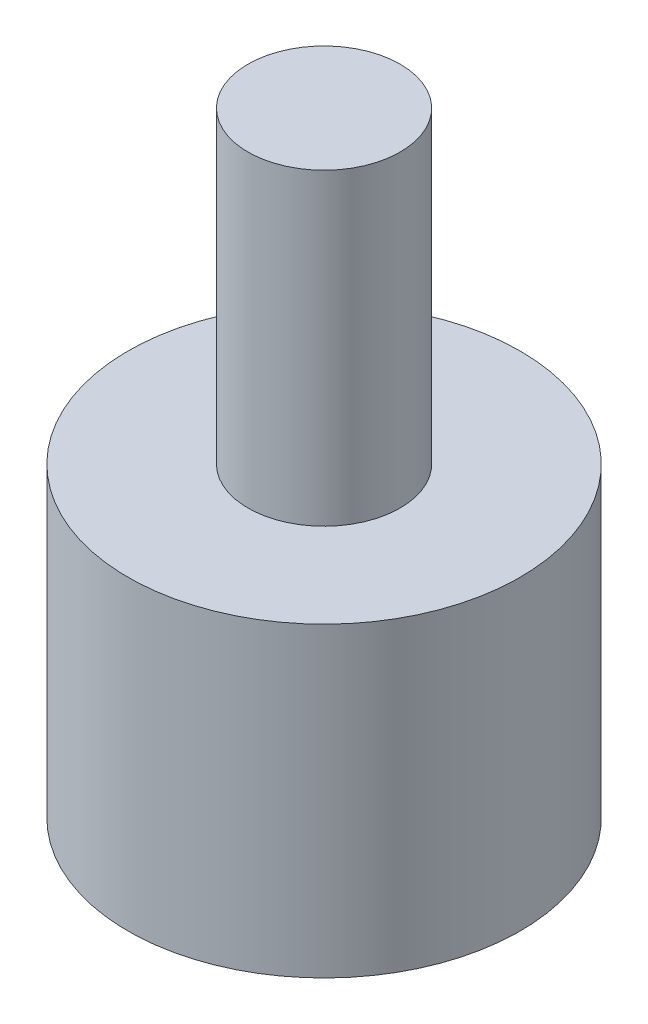
ISO-10303-21;
HEADER;
FILE_DESCRIPTION(('STEP AP214'),'2;1');
FILE_NAME('part.step','',(''),(''),'','','');
FILE_SCHEMA(('AUTOMOTIVE_DESIGN { 1 0 10303 214 1 1 1 1 }'));
ENDSEC;
DATA;
#1=APPLICATION_CONTEXT('core data for automotive mechanical design processes');
#2=APPLICATION_PROTOCOL_DEFINITION('international standard','automotive_design',2000,#1);
#3=PRODUCT_CONTEXT('',#1,'mechanical');
#4=PRODUCT('Part','Part','',(#3));
#5=PRODUCT_RELATED_PRODUCT_CATEGORY('part','',(#4));
#6=PRODUCT_DEFINITION_FORMATION('','',#4);
#7=PRODUCT_DEFINITION_CONTEXT('part definition',#1,'design');
#8=PRODUCT_DEFINITION('design','',#6,#7);
#9=PRODUCT_DEFINITION_SHAPE('','',#8);
#10=(LENGTH_UNIT() NAMED_UNIT(*) SI_UNIT(.MILLI.,.METRE.));
#11=(NAMED_UNIT(*) PLANE_ANGLE_UNIT() SI_UNIT($,.RADIAN.));
#12=(NAMED_UNIT(*) SI_UNIT($,.STERADIAN.) SOLID_ANGLE_UNIT());
#13=UNCERTAINTY_MEASURE_WITH_UNIT(LENGTH_MEASURE(1.E-05),#10,'distance_accuracy_value','');
#14=(GEOMETRIC_REPRESENTATION_CONTEXT(3) GLOBAL_UNCERTAINTY_ASSIGNED_CONTEXT((#13)) GLOBAL_UNIT_ASSIGNED_CONTEXT((#10,
#11,#12)) REPRESENTATION_CONTEXT('',''));
#15=CARTESIAN_POINT('',(0.,0.,0.));
#16=DIRECTION('',(0.,0.,1.));
#17=DIRECTION('',(1.,0.,0.));
#18=AXIS2_PLACEMENT_3D('',#15,#16,#17);
#19=CARTESIAN_POINT('',(0.,6.35,0.));
#20=DIRECTION('',(0.,-1.,0.));
#21=DIRECTION('',(-1.,0.,0.));
#22=AXIS2_PLACEMENT_3D('',#19,#20,#21);
#23=SPHERICAL_SURFACE('',#22,6.35);
#24=CARTESIAN_POINT('',(0.,3.5,0.));
#25=DIRECTION('',(0.,-1.,0.));
#26=DIRECTION('',(0.,0.,-1.));
#27=AXIS2_PLACEMENT_3D('',#24,#25,#26);
#28=CIRCLE('',#27,5.67450438364444);
#29=CARTESIAN_POINT('',(0.,3.5,-5.67450438364444));
#30=VERTEX_POINT('',#29);
#31=EDGE_CURVE('E10',#30,#30,#28,.T.);
#32=ORIENTED_EDGE('',*,*,#31,.T.);
#33=EDGE_LOOP('',(#32));
#34=FACE_BOUND('',#33,.T.);
#35=ADVANCED_FACE('F30',(#34),#23,.T.);
#36=CARTESIAN_POINT('',(5.67450438364444,3.5,0.));
#37=DIRECTION('',(0.,-1.,0.));
#38=DIRECTION('',(0.,0.,-1.));
#39=AXIS2_PLACEMENT_3D('',#36,#37,#38);
#40=PLANE('',#39);
#41=CARTESIAN_POINT('',(0.,3.5,0.));
#42=DIRECTION('',(0.,-1.,0.));
#43=DIRECTION('',(0.,0.,-1.));
#44=AXIS2_PLACEMENT_3D('',#41,#42,#43);
#45=CIRCLE('',#44,10.3);
#46=CARTESIAN_POINT('',(0.,3.5,-10.3));
#47=VERTEX_POINT('',#46);
#48=EDGE_CURVE('E36',#47,#47,#45,.T.);
#49=ORIENTED_EDGE('',*,*,#48,.T.);
#50=EDGE_LOOP('',(#49));
#51=FACE_BOUND('',#50,.T.);
#52=ORIENTED_EDGE('',*,*,#31,.F.);
#53=EDGE_LOOP('',(#52));
#54=FACE_BOUND('',#53,.T.);
#55=ADVANCED_FACE('F65',(#51,#54),#40,.T.);
#56=CARTESIAN_POINT('',(0.,-22.939375,0.));
#57=DIRECTION('',(0.,-1.,0.));
#58=DIRECTION('',(0.,0.,-1.));
#59=AXIS2_PLACEMENT_3D('',#56,#57,#58);
#60=CYLINDRICAL_SURFACE('',#59,10.3);
#61=CARTESIAN_POINT('',(0.,19.6,0.));
#62=DIRECTION('',(0.,-1.,0.));
#63=DIRECTION('',(0.,0.,-1.));
#64=AXIS2_PLACEMENT_3D('',#61,#62,#63);
#65=CIRCLE('',#64,10.3);
#66=CARTESIAN_POINT('',(0.,19.6,-10.3));
#67=VERTEX_POINT('',#66);
#68=EDGE_CURVE('E40',#67,#67,#65,.T.);
#69=ORIENTED_EDGE('',*,*,#68,.T.);
#70=EDGE_LOOP('',(#69));
#71=FACE_BOUND('',#70,.T.);
#72=ORIENTED_EDGE('',*,*,#48,.F.);
#73=EDGE_LOOP('',(#72));
#74=FACE_BOUND('',#73,.T.);
#75=ADVANCED_FACE('F69',(#71,#74),#60,.T.);
#76=CARTESIAN_POINT('',(10.3,19.6,0.));
#77=DIRECTION('',(0.,1.,0.));
#78=DIRECTION('',(0.,0.,1.));
#79=AXIS2_PLACEMENT_3D('',#76,#77,#78);
#80=PLANE('',#79);
#81=CARTESIAN_POINT('',(0.,19.6,0.));
#82=DIRECTION('',(0.,-1.,0.));
#83=DIRECTION('',(0.,0.,-1.));
#84=AXIS2_PLACEMENT_3D('',#81,#82,#83);
#85=CIRCLE('',#84,4.);
#86=CARTESIAN_POINT('',(0.,19.6,-4.));
#87=VERTEX_POINT('',#86);
#88=EDGE_CURVE('E44',#87,#87,#85,.T.);
#89=ORIENTED_EDGE('',*,*,#88,.T.);
#90=EDGE_LOOP('',(#89));
#91=FACE_BOUND('',#90,.T.);
#92=ORIENTED_EDGE('',*,*,#68,.F.);
#93=EDGE_LOOP('',(#92));
#94=FACE_BOUND('',#93,.T.);
#95=ADVANCED_FACE('F62',(#91,#94),#80,.T.);
#96=CARTESIAN_POINT('',(0.,-22.939375,0.));
#97=DIRECTION('',(0.,-1.,0.));
#98=DIRECTION('',(0.,0.,-1.));
#99=AXIS2_PLACEMENT_3D('',#96,#97,#98);
#100=CYLINDRICAL_SURFACE('',#99,4.);
#101=CARTESIAN_POINT('',(0.,35.8,0.));
#102=DIRECTION('',(0.,-1.,0.));
#103=DIRECTION('',(0.,0.,-1.));
#104=AXIS2_PLACEMENT_3D('',#101,#102,#103);
#105=CIRCLE('',#104,4.);
#106=CARTESIAN_POINT('',(0.,35.8,-4.));
#107=VERTEX_POINT('',#106);
#108=EDGE_CURVE('E49',#107,#107,#105,.T.);
#109=ORIENTED_EDGE('',*,*,#108,.T.);
#110=EDGE_LOOP('',(#109));
#111=FACE_BOUND('',#110,.T.);
#112=ORIENTED_EDGE('',*,*,#88,.F.);
#113=EDGE_LOOP('',(#112));
#114=FACE_BOUND('',#113,.T.);
#115=ADVANCED_FACE('F53',(#111,#114),#100,.T.);
#116=CARTESIAN_POINT('',(4.,35.8,0.));
#117=DIRECTION('',(0.,1.,0.));
#118=DIRECTION('',(0.,0.,1.));
#119=AXIS2_PLACEMENT_3D('',#116,#117,#118);
#120=PLANE('',#119);
#121=ORIENTED_EDGE('',*,*,#108,.F.);
#122=EDGE_LOOP('',(#121));
#123=FACE_BOUND('',#122,.T.);
#124=ADVANCED_FACE('F56',(#123),#120,.T.);
#125=CLOSED_SHELL('',(#35,#55,#75,#95,#115,#124));
#126=MANIFOLD_SOLID_BREP('B2',#125);
#127=ADVANCED_BREP_SHAPE_REPRESENTATION('',(#18,#126),#14);
#128=SHAPE_DEFINITION_REPRESENTATION(#9,#127);
ENDSEC;
END-ISO-10303-21;
